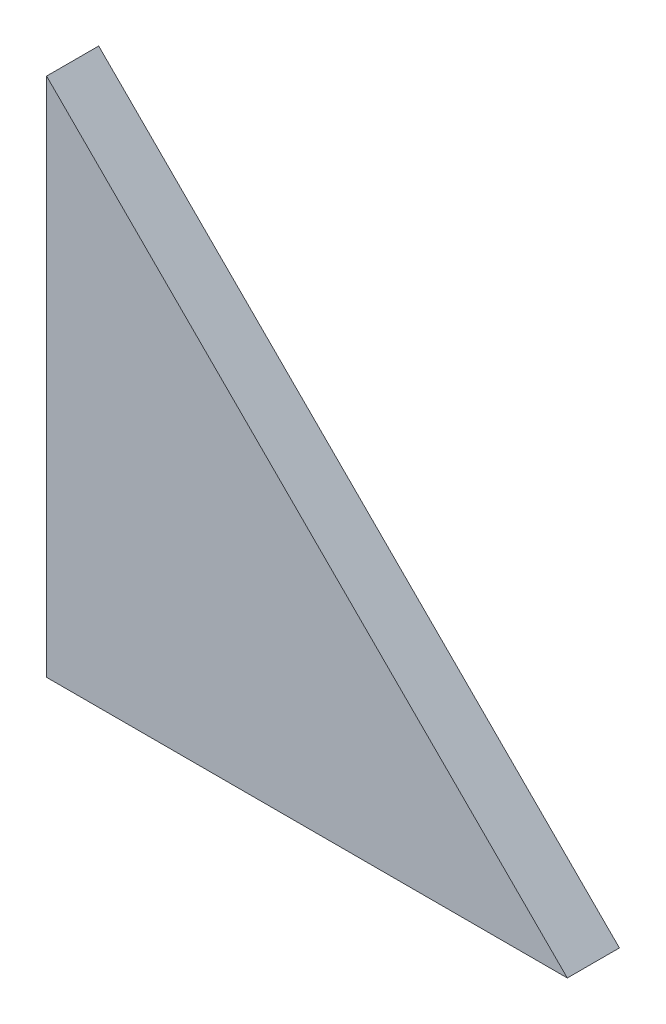
ISO-10303-21;
HEADER;
FILE_DESCRIPTION(('STEP AP214'),'2;1');
FILE_NAME('part.step','',(''),(''),'','','');
FILE_SCHEMA(('AUTOMOTIVE_DESIGN { 1 0 10303 214 1 1 1 1 }'));
ENDSEC;
DATA;
#1=APPLICATION_CONTEXT('core data for automotive mechanical design processes');
#2=APPLICATION_PROTOCOL_DEFINITION('international standard','automotive_design',2000,#1);
#3=PRODUCT_CONTEXT('',#1,'mechanical');
#4=PRODUCT('Part','Part','',(#3));
#5=PRODUCT_RELATED_PRODUCT_CATEGORY('part','',(#4));
#6=PRODUCT_DEFINITION_FORMATION('','',#4);
#7=PRODUCT_DEFINITION_CONTEXT('part definition',#1,'design');
#8=PRODUCT_DEFINITION('design','',#6,#7);
#9=PRODUCT_DEFINITION_SHAPE('','',#8);
#10=(LENGTH_UNIT() NAMED_UNIT(*) SI_UNIT(.MILLI.,.METRE.));
#11=(NAMED_UNIT(*) PLANE_ANGLE_UNIT() SI_UNIT($,.RADIAN.));
#12=(NAMED_UNIT(*) SI_UNIT($,.STERADIAN.) SOLID_ANGLE_UNIT());
#13=UNCERTAINTY_MEASURE_WITH_UNIT(LENGTH_MEASURE(1.E-05),#10,'distance_accuracy_value','');
#14=(GEOMETRIC_REPRESENTATION_CONTEXT(3) GLOBAL_UNCERTAINTY_ASSIGNED_CONTEXT((#13)) GLOBAL_UNIT_ASSIGNED_CONTEXT((#10,
#11,#12)) REPRESENTATION_CONTEXT('',''));
#15=CARTESIAN_POINT('',(0.,0.,0.));
#16=DIRECTION('',(0.,0.,1.));
#17=DIRECTION('',(1.,0.,0.));
#18=AXIS2_PLACEMENT_3D('',#15,#16,#17);
#19=CARTESIAN_POINT('',(40.,0.,4.));
#20=DIRECTION('',(0.,1.,0.));
#21=DIRECTION('',(-1.,0.,0.));
#22=AXIS2_PLACEMENT_3D('',#19,#20,#21);
#23=PLANE('',#22);
#24=DIRECTION('',(1.,0.,0.));
#25=VECTOR('',#24,1.);
#26=CARTESIAN_POINT('',(40.,0.,0.));
#27=LINE('',#26,#25);
#28=CARTESIAN_POINT('',(0.,0.,0.));
#29=VERTEX_POINT('',#28);
#30=CARTESIAN_POINT('',(40.,0.,0.));
#31=VERTEX_POINT('',#30);
#32=EDGE_CURVE('E88',#29,#31,#27,.T.);
#33=ORIENTED_EDGE('',*,*,#32,.T.);
#34=DIRECTION('',(0.,0.,-1.));
#35=VECTOR('',#34,1.);
#36=CARTESIAN_POINT('',(40.,0.,4.));
#37=LINE('',#36,#35);
#38=CARTESIAN_POINT('',(40.,0.,4.));
#39=VERTEX_POINT('',#38);
#40=EDGE_CURVE('E11',#39,#31,#37,.T.);
#41=ORIENTED_EDGE('',*,*,#40,.F.);
#42=DIRECTION('',(1.,0.,0.));
#43=VECTOR('',#42,1.);
#44=CARTESIAN_POINT('',(40.,0.,4.));
#45=LINE('',#44,#43);
#46=CARTESIAN_POINT('',(0.,0.,4.));
#47=VERTEX_POINT('',#46);
#48=EDGE_CURVE('E81',#47,#39,#45,.T.);
#49=ORIENTED_EDGE('',*,*,#48,.F.);
#50=DIRECTION('',(0.,0.,-1.));
#51=VECTOR('',#50,1.);
#52=CARTESIAN_POINT('',(0.,0.,4.));
#53=LINE('',#52,#51);
#54=EDGE_CURVE('E89',#47,#29,#53,.T.);
#55=ORIENTED_EDGE('',*,*,#54,.T.);
#56=EDGE_LOOP('',(#33,#41,#49,#55));
#57=FACE_BOUND('',#56,.T.);
#58=ADVANCED_FACE('F41',(#57),#23,.F.);
#59=CARTESIAN_POINT('',(0.,40.,4.));
#60=DIRECTION('',(-0.707106781186547,-0.707106781186547,0.));
#61=DIRECTION('',(0.707106781186548,-0.707106781186548,0.));
#62=AXIS2_PLACEMENT_3D('',#59,#60,#61);
#63=PLANE('',#62);
#64=DIRECTION('',(-0.707106781186548,0.707106781186548,0.));
#65=VECTOR('',#64,1.);
#66=CARTESIAN_POINT('',(0.,40.,0.));
#67=LINE('',#66,#65);
#68=CARTESIAN_POINT('',(0.,40.,0.));
#69=VERTEX_POINT('',#68);
#70=EDGE_CURVE('E69',#31,#69,#67,.T.);
#71=ORIENTED_EDGE('',*,*,#70,.T.);
#72=DIRECTION('',(0.,0.,-1.));
#73=VECTOR('',#72,1.);
#74=CARTESIAN_POINT('',(0.,40.,4.));
#75=LINE('',#74,#73);
#76=CARTESIAN_POINT('',(0.,40.,4.));
#77=VERTEX_POINT('',#76);
#78=EDGE_CURVE('E49',#77,#69,#75,.T.);
#79=ORIENTED_EDGE('',*,*,#78,.F.);
#80=DIRECTION('',(-0.707106781186548,0.707106781186548,0.));
#81=VECTOR('',#80,1.);
#82=CARTESIAN_POINT('',(0.,40.,4.));
#83=LINE('',#82,#81);
#84=EDGE_CURVE('E77',#39,#77,#83,.T.);
#85=ORIENTED_EDGE('',*,*,#84,.F.);
#86=ORIENTED_EDGE('',*,*,#40,.T.);
#87=EDGE_LOOP('',(#71,#79,#85,#86));
#88=FACE_BOUND('',#87,.T.);
#89=ADVANCED_FACE('F78',(#88),#63,.F.);
#90=CARTESIAN_POINT('',(0.,0.,4.));
#91=DIRECTION('',(1.,0.,0.));
#92=DIRECTION('',(0.,0.,-1.));
#93=AXIS2_PLACEMENT_3D('',#90,#91,#92);
#94=PLANE('',#93);
#95=DIRECTION('',(0.,-1.,0.));
#96=VECTOR('',#95,1.);
#97=CARTESIAN_POINT('',(0.,0.,0.));
#98=LINE('',#97,#96);
#99=EDGE_CURVE('E74',#69,#29,#98,.T.);
#100=ORIENTED_EDGE('',*,*,#99,.T.);
#101=ORIENTED_EDGE('',*,*,#54,.F.);
#102=DIRECTION('',(0.,-1.,0.));
#103=VECTOR('',#102,1.);
#104=CARTESIAN_POINT('',(0.,0.,4.));
#105=LINE('',#104,#103);
#106=EDGE_CURVE('E57',#77,#47,#105,.T.);
#107=ORIENTED_EDGE('',*,*,#106,.F.);
#108=ORIENTED_EDGE('',*,*,#78,.T.);
#109=EDGE_LOOP('',(#100,#101,#107,#108));
#110=FACE_BOUND('',#109,.T.);
#111=ADVANCED_FACE('F96',(#110),#94,.F.);
#112=CARTESIAN_POINT('',(0.,0.,4.));
#113=DIRECTION('',(0.,0.,-1.));
#114=DIRECTION('',(-1.,0.,0.));
#115=AXIS2_PLACEMENT_3D('',#112,#113,#114);
#116=PLANE('',#115);
#117=ORIENTED_EDGE('',*,*,#48,.T.);
#118=ORIENTED_EDGE('',*,*,#84,.T.);
#119=ORIENTED_EDGE('',*,*,#106,.T.);
#120=EDGE_LOOP('',(#117,#118,#119));
#121=FACE_BOUND('',#120,.T.);
#122=ADVANCED_FACE('F84',(#121),#116,.F.);
#123=CARTESIAN_POINT('',(0.,0.,0.));
#124=DIRECTION('',(0.,0.,-1.));
#125=DIRECTION('',(-1.,0.,0.));
#126=AXIS2_PLACEMENT_3D('',#123,#124,#125);
#127=PLANE('',#126);
#128=ORIENTED_EDGE('',*,*,#32,.F.);
#129=ORIENTED_EDGE('',*,*,#99,.F.);
#130=ORIENTED_EDGE('',*,*,#70,.F.);
#131=EDGE_LOOP('',(#128,#129,#130));
#132=FACE_BOUND('',#131,.T.);
#133=ADVANCED_FACE('F97',(#132),#127,.T.);
#134=CLOSED_SHELL('',(#58,#89,#111,#122,#133));
#135=MANIFOLD_SOLID_BREP('B2',#134);
#136=ADVANCED_BREP_SHAPE_REPRESENTATION('',(#18,#135),#14);
#137=SHAPE_DEFINITION_REPRESENTATION(#9,#136);
ENDSEC;
END-ISO-10303-21;
